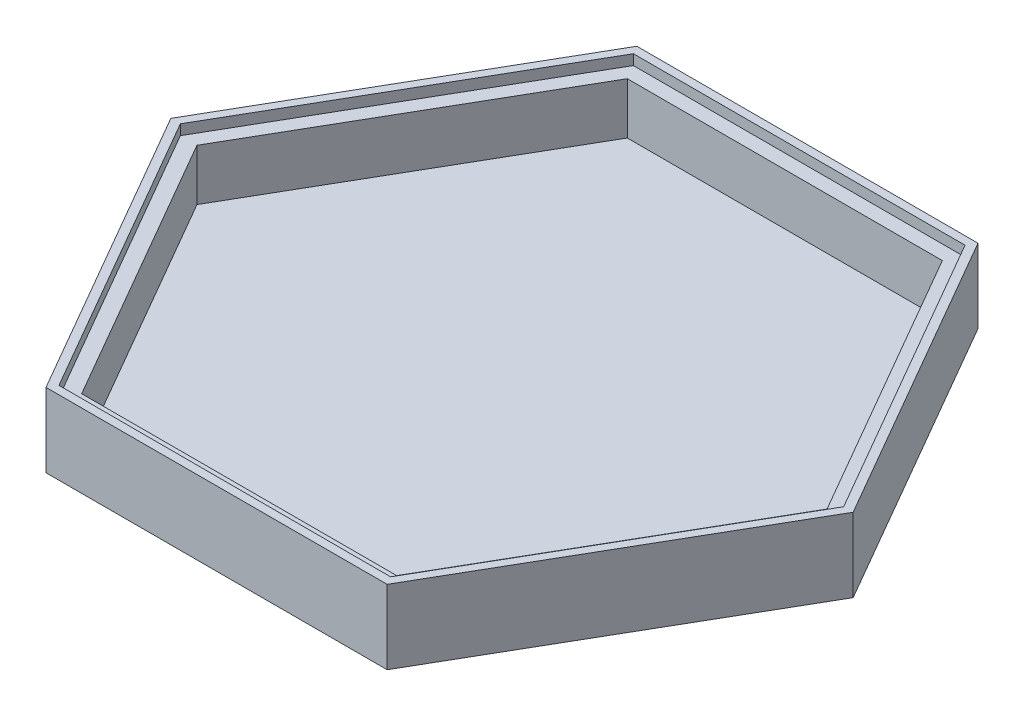
ISO-10303-21;
HEADER;
FILE_DESCRIPTION(('STEP AP214'),'2;1');
FILE_NAME('part.step','',(''),(''),'','','');
FILE_SCHEMA(('AUTOMOTIVE_DESIGN { 1 0 10303 214 1 1 1 1 }'));
ENDSEC;
DATA;
#1=APPLICATION_CONTEXT('core data for automotive mechanical design processes');
#2=APPLICATION_PROTOCOL_DEFINITION('international standard','automotive_design',2000,#1);
#3=PRODUCT_CONTEXT('',#1,'mechanical');
#4=PRODUCT('Part','Part','',(#3));
#5=PRODUCT_RELATED_PRODUCT_CATEGORY('part','',(#4));
#6=PRODUCT_DEFINITION_FORMATION('','',#4);
#7=PRODUCT_DEFINITION_CONTEXT('part definition',#1,'design');
#8=PRODUCT_DEFINITION('design','',#6,#7);
#9=PRODUCT_DEFINITION_SHAPE('','',#8);
#10=(LENGTH_UNIT() NAMED_UNIT(*) SI_UNIT(.MILLI.,.METRE.));
#11=(NAMED_UNIT(*) PLANE_ANGLE_UNIT() SI_UNIT($,.RADIAN.));
#12=(NAMED_UNIT(*) SI_UNIT($,.STERADIAN.) SOLID_ANGLE_UNIT());
#13=UNCERTAINTY_MEASURE_WITH_UNIT(LENGTH_MEASURE(1.E-05),#10,'distance_accuracy_value','');
#14=(GEOMETRIC_REPRESENTATION_CONTEXT(3) GLOBAL_UNCERTAINTY_ASSIGNED_CONTEXT((#13)) GLOBAL_UNIT_ASSIGNED_CONTEXT((#10,
#11,#12)) REPRESENTATION_CONTEXT('',''));
#15=CARTESIAN_POINT('',(0.,0.,0.));
#16=DIRECTION('',(0.,0.,1.));
#17=DIRECTION('',(1.,0.,0.));
#18=AXIS2_PLACEMENT_3D('',#15,#16,#17);
#19=CARTESIAN_POINT('',(0.,10.,-53.1000000000001));
#20=DIRECTION('',(0.,0.,1.));
#21=DIRECTION('',(1.,0.,0.));
#22=AXIS2_PLACEMENT_3D('',#19,#20,#21);
#23=PLANE('',#22);
#24=DIRECTION('',(-1.,0.,0.));
#25=VECTOR('',#24,1.);
#26=CARTESIAN_POINT('',(0.,0.,-53.1000000000001));
#27=LINE('',#26,#25);
#28=CARTESIAN_POINT('',(30.6572992939691,0.,-53.1000000000001));
#29=VERTEX_POINT('',#28);
#30=CARTESIAN_POINT('',(-30.6572992939692,0.,-53.1000000000001));
#31=VERTEX_POINT('',#30);
#32=EDGE_CURVE('E276',#29,#31,#27,.T.);
#33=ORIENTED_EDGE('',*,*,#32,.F.);
#34=DIRECTION('',(0.,-1.,0.));
#35=VECTOR('',#34,1.);
#36=CARTESIAN_POINT('',(30.6572992939691,10.,-53.1000000000001));
#37=LINE('',#36,#35);
#38=CARTESIAN_POINT('',(30.6572992939691,10.,-53.1000000000001));
#39=VERTEX_POINT('',#38);
#40=EDGE_CURVE('E388',#39,#29,#37,.T.);
#41=ORIENTED_EDGE('',*,*,#40,.F.);
#42=DIRECTION('',(-1.,0.,0.));
#43=VECTOR('',#42,1.);
#44=CARTESIAN_POINT('',(0.,10.,-53.1000000000001));
#45=LINE('',#44,#43);
#46=CARTESIAN_POINT('',(-30.6572992939692,10.,-53.1000000000001));
#47=VERTEX_POINT('',#46);
#48=EDGE_CURVE('E332',#39,#47,#45,.T.);
#49=ORIENTED_EDGE('',*,*,#48,.T.);
#50=DIRECTION('',(0.,-1.,0.));
#51=VECTOR('',#50,1.);
#52=CARTESIAN_POINT('',(-30.6572992939692,10.,-53.1000000000001));
#53=LINE('',#52,#51);
#54=EDGE_CURVE('E366',#47,#31,#53,.T.);
#55=ORIENTED_EDGE('',*,*,#54,.T.);
#56=EDGE_LOOP('',(#33,#41,#49,#55));
#57=FACE_BOUND('',#56,.T.);
#58=ADVANCED_FACE('F140',(#57),#23,.T.);
#59=CARTESIAN_POINT('',(45.9859489409537,10.,-26.55));
#60=DIRECTION('',(-0.866025403784439,0.,0.5));
#61=DIRECTION('',(0.5,0.,0.866025403784439));
#62=AXIS2_PLACEMENT_3D('',#59,#60,#61);
#63=PLANE('',#62);
#64=DIRECTION('',(-0.5,0.,-0.866025403784439));
#65=VECTOR('',#64,1.);
#66=CARTESIAN_POINT('',(45.9859489409537,0.,-26.55));
#67=LINE('',#66,#65);
#68=CARTESIAN_POINT('',(61.3145985879383,0.,0.));
#69=VERTEX_POINT('',#68);
#70=EDGE_CURVE('E157',#69,#29,#67,.T.);
#71=ORIENTED_EDGE('',*,*,#70,.F.);
#72=DIRECTION('',(0.,-1.,0.));
#73=VECTOR('',#72,1.);
#74=CARTESIAN_POINT('',(61.3145985879383,10.,0.));
#75=LINE('',#74,#73);
#76=CARTESIAN_POINT('',(61.3145985879383,10.,0.));
#77=VERTEX_POINT('',#76);
#78=EDGE_CURVE('E386',#77,#69,#75,.T.);
#79=ORIENTED_EDGE('',*,*,#78,.F.);
#80=DIRECTION('',(-0.5,0.,-0.866025403784439));
#81=VECTOR('',#80,1.);
#82=CARTESIAN_POINT('',(45.9859489409537,10.,-26.55));
#83=LINE('',#82,#81);
#84=EDGE_CURVE('E335',#77,#39,#83,.T.);
#85=ORIENTED_EDGE('',*,*,#84,.T.);
#86=ORIENTED_EDGE('',*,*,#40,.T.);
#87=EDGE_LOOP('',(#71,#79,#85,#86));
#88=FACE_BOUND('',#87,.T.);
#89=ADVANCED_FACE('F447',(#88),#63,.T.);
#90=CARTESIAN_POINT('',(45.9859489409537,10.,26.55));
#91=DIRECTION('',(-0.866025403784439,0.,-0.5));
#92=DIRECTION('',(-0.5,0.,0.866025403784439));
#93=AXIS2_PLACEMENT_3D('',#90,#91,#92);
#94=PLANE('',#93);
#95=DIRECTION('',(0.5,0.,-0.866025403784439));
#96=VECTOR('',#95,1.);
#97=CARTESIAN_POINT('',(45.9859489409537,0.,26.55));
#98=LINE('',#97,#96);
#99=CARTESIAN_POINT('',(30.6572992939691,0.,53.1000000000001));
#100=VERTEX_POINT('',#99);
#101=EDGE_CURVE('E162',#100,#69,#98,.T.);
#102=ORIENTED_EDGE('',*,*,#101,.F.);
#103=DIRECTION('',(0.,-1.,0.));
#104=VECTOR('',#103,1.);
#105=CARTESIAN_POINT('',(30.6572992939691,10.,53.1000000000001));
#106=LINE('',#105,#104);
#107=CARTESIAN_POINT('',(30.6572992939691,10.,53.1000000000001));
#108=VERTEX_POINT('',#107);
#109=EDGE_CURVE('E383',#108,#100,#106,.T.);
#110=ORIENTED_EDGE('',*,*,#109,.F.);
#111=DIRECTION('',(0.5,0.,-0.866025403784439));
#112=VECTOR('',#111,1.);
#113=CARTESIAN_POINT('',(45.9859489409537,10.,26.55));
#114=LINE('',#113,#112);
#115=EDGE_CURVE('E339',#108,#77,#114,.T.);
#116=ORIENTED_EDGE('',*,*,#115,.T.);
#117=ORIENTED_EDGE('',*,*,#78,.T.);
#118=EDGE_LOOP('',(#102,#110,#116,#117));
#119=FACE_BOUND('',#118,.T.);
#120=ADVANCED_FACE('F453',(#119),#94,.T.);
#121=CARTESIAN_POINT('',(0.,10.,53.1000000000001));
#122=DIRECTION('',(0.,0.,-1.));
#123=DIRECTION('',(-1.,0.,0.));
#124=AXIS2_PLACEMENT_3D('',#121,#122,#123);
#125=PLANE('',#124);
#126=DIRECTION('',(1.,0.,0.));
#127=VECTOR('',#126,1.);
#128=CARTESIAN_POINT('',(0.,0.,53.1000000000001));
#129=LINE('',#128,#127);
#130=CARTESIAN_POINT('',(-30.6572992939691,0.,53.1000000000001));
#131=VERTEX_POINT('',#130);
#132=EDGE_CURVE('E370',#131,#100,#129,.T.);
#133=ORIENTED_EDGE('',*,*,#132,.F.);
#134=DIRECTION('',(0.,-1.,0.));
#135=VECTOR('',#134,1.);
#136=CARTESIAN_POINT('',(-30.6572992939691,10.,53.1000000000001));
#137=LINE('',#136,#135);
#138=CARTESIAN_POINT('',(-30.6572992939691,10.,53.1000000000001));
#139=VERTEX_POINT('',#138);
#140=EDGE_CURVE('E380',#139,#131,#137,.T.);
#141=ORIENTED_EDGE('',*,*,#140,.F.);
#142=DIRECTION('',(1.,0.,0.));
#143=VECTOR('',#142,1.);
#144=CARTESIAN_POINT('',(0.,10.,53.1000000000001));
#145=LINE('',#144,#143);
#146=EDGE_CURVE('E342',#139,#108,#145,.T.);
#147=ORIENTED_EDGE('',*,*,#146,.T.);
#148=ORIENTED_EDGE('',*,*,#109,.T.);
#149=EDGE_LOOP('',(#133,#141,#147,#148));
#150=FACE_BOUND('',#149,.T.);
#151=ADVANCED_FACE('F482',(#150),#125,.T.);
#152=CARTESIAN_POINT('',(-45.9859489409537,10.,26.55));
#153=DIRECTION('',(0.866025403784439,0.,-0.5));
#154=DIRECTION('',(-0.5,0.,-0.866025403784439));
#155=AXIS2_PLACEMENT_3D('',#152,#153,#154);
#156=PLANE('',#155);
#157=DIRECTION('',(0.5,0.,0.866025403784439));
#158=VECTOR('',#157,1.);
#159=CARTESIAN_POINT('',(-45.9859489409537,0.,26.55));
#160=LINE('',#159,#158);
#161=CARTESIAN_POINT('',(-61.3145985879383,0.,0.));
#162=VERTEX_POINT('',#161);
#163=EDGE_CURVE('E372',#162,#131,#160,.T.);
#164=ORIENTED_EDGE('',*,*,#163,.F.);
#165=DIRECTION('',(0.,-1.,0.));
#166=VECTOR('',#165,1.);
#167=CARTESIAN_POINT('',(-61.3145985879383,10.,0.));
#168=LINE('',#167,#166);
#169=CARTESIAN_POINT('',(-61.3145985879383,10.,0.));
#170=VERTEX_POINT('',#169);
#171=EDGE_CURVE('E377',#170,#162,#168,.T.);
#172=ORIENTED_EDGE('',*,*,#171,.F.);
#173=DIRECTION('',(0.5,0.,0.866025403784439));
#174=VECTOR('',#173,1.);
#175=CARTESIAN_POINT('',(-45.9859489409537,10.,26.55));
#176=LINE('',#175,#174);
#177=EDGE_CURVE('E345',#170,#139,#176,.T.);
#178=ORIENTED_EDGE('',*,*,#177,.T.);
#179=ORIENTED_EDGE('',*,*,#140,.T.);
#180=EDGE_LOOP('',(#164,#172,#178,#179));
#181=FACE_BOUND('',#180,.T.);
#182=ADVANCED_FACE('F479',(#181),#156,.T.);
#183=CARTESIAN_POINT('',(-45.9859489409537,10.,-26.55));
#184=DIRECTION('',(0.866025403784439,0.,0.5));
#185=DIRECTION('',(0.5,0.,-0.866025403784439));
#186=AXIS2_PLACEMENT_3D('',#183,#184,#185);
#187=PLANE('',#186);
#188=DIRECTION('',(-0.5,0.,0.866025403784439));
#189=VECTOR('',#188,1.);
#190=CARTESIAN_POINT('',(-45.9859489409537,0.,-26.55));
#191=LINE('',#190,#189);
#192=EDGE_CURVE('E336',#31,#162,#191,.T.);
#193=ORIENTED_EDGE('',*,*,#192,.F.);
#194=ORIENTED_EDGE('',*,*,#54,.F.);
#195=DIRECTION('',(-0.5,0.,0.866025403784439));
#196=VECTOR('',#195,1.);
#197=CARTESIAN_POINT('',(-45.9859489409537,10.,-26.55));
#198=LINE('',#197,#196);
#199=EDGE_CURVE('E348',#47,#170,#198,.T.);
#200=ORIENTED_EDGE('',*,*,#199,.T.);
#201=ORIENTED_EDGE('',*,*,#171,.T.);
#202=EDGE_LOOP('',(#193,#194,#200,#201));
#203=FACE_BOUND('',#202,.T.);
#204=ADVANCED_FACE('F469',(#203),#187,.T.);
#205=CARTESIAN_POINT('',(0.,10.,0.));
#206=DIRECTION('',(0.,1.,0.));
#207=DIRECTION('',(0.,0.,1.));
#208=AXIS2_PLACEMENT_3D('',#205,#206,#207);
#209=PLANE('',#208);
#210=ORIENTED_EDGE('',*,*,#48,.F.);
#211=ORIENTED_EDGE('',*,*,#84,.F.);
#212=ORIENTED_EDGE('',*,*,#115,.F.);
#213=ORIENTED_EDGE('',*,*,#146,.F.);
#214=ORIENTED_EDGE('',*,*,#177,.F.);
#215=ORIENTED_EDGE('',*,*,#199,.F.);
#216=EDGE_LOOP('',(#210,#211,#212,#213,#214,#215));
#217=FACE_BOUND('',#216,.T.);
#218=DIRECTION('',(0.5,0.,-0.866025403784439));
#219=VECTOR('',#218,1.);
#220=CARTESIAN_POINT('',(48.4108200715501,10.,27.95));
#221=LINE('',#220,#219);
#222=CARTESIAN_POINT('',(32.2738800477001,10.,55.9000000000001));
#223=VERTEX_POINT('',#222);
#224=CARTESIAN_POINT('',(64.5477600954002,10.,0.));
#225=VERTEX_POINT('',#224);
#226=EDGE_CURVE('E351',#223,#225,#221,.T.);
#227=ORIENTED_EDGE('',*,*,#226,.T.);
#228=DIRECTION('',(-0.5,0.,-0.866025403784439));
#229=VECTOR('',#228,1.);
#230=CARTESIAN_POINT('',(48.4108200715501,10.,-27.95));
#231=LINE('',#230,#229);
#232=CARTESIAN_POINT('',(32.2738800477001,10.,-55.9000000000001));
#233=VERTEX_POINT('',#232);
#234=EDGE_CURVE('E272',#225,#233,#231,.T.);
#235=ORIENTED_EDGE('',*,*,#234,.T.);
#236=DIRECTION('',(-1.,0.,0.));
#237=VECTOR('',#236,1.);
#238=CARTESIAN_POINT('',(0.,10.,-55.9000000000001));
#239=LINE('',#238,#237);
#240=CARTESIAN_POINT('',(-32.2738800477001,10.,-55.9000000000001));
#241=VERTEX_POINT('',#240);
#242=EDGE_CURVE('E354',#233,#241,#239,.T.);
#243=ORIENTED_EDGE('',*,*,#242,.T.);
#244=DIRECTION('',(-0.5,0.,0.866025403784439));
#245=VECTOR('',#244,1.);
#246=CARTESIAN_POINT('',(-48.4108200715502,10.,-27.95));
#247=LINE('',#246,#245);
#248=CARTESIAN_POINT('',(-64.5477600954002,10.,0.));
#249=VERTEX_POINT('',#248);
#250=EDGE_CURVE('E357',#241,#249,#247,.T.);
#251=ORIENTED_EDGE('',*,*,#250,.T.);
#252=DIRECTION('',(0.5,0.,0.866025403784439));
#253=VECTOR('',#252,1.);
#254=CARTESIAN_POINT('',(-48.4108200715502,10.,27.95));
#255=LINE('',#254,#253);
#256=CARTESIAN_POINT('',(-32.2738800477001,10.,55.9));
#257=VERTEX_POINT('',#256);
#258=EDGE_CURVE('E360',#249,#257,#255,.T.);
#259=ORIENTED_EDGE('',*,*,#258,.T.);
#260=DIRECTION('',(1.,0.,0.));
#261=VECTOR('',#260,1.);
#262=CARTESIAN_POINT('',(0.,10.,55.9000000000001));
#263=LINE('',#262,#261);
#264=EDGE_CURVE('E363',#257,#223,#263,.T.);
#265=ORIENTED_EDGE('',*,*,#264,.T.);
#266=EDGE_LOOP('',(#227,#235,#243,#251,#259,#265));
#267=FACE_BOUND('',#266,.T.);
#268=ADVANCED_FACE('F463',(#217,#267),#209,.T.);
#269=CARTESIAN_POINT('',(0.,0.,0.));
#270=DIRECTION('',(0.,1.,0.));
#271=DIRECTION('',(0.,0.,1.));
#272=AXIS2_PLACEMENT_3D('',#269,#270,#271);
#273=PLANE('',#272);
#274=ORIENTED_EDGE('',*,*,#32,.T.);
#275=ORIENTED_EDGE('',*,*,#192,.T.);
#276=ORIENTED_EDGE('',*,*,#163,.T.);
#277=ORIENTED_EDGE('',*,*,#132,.T.);
#278=ORIENTED_EDGE('',*,*,#101,.T.);
#279=ORIENTED_EDGE('',*,*,#70,.T.);
#280=EDGE_LOOP('',(#274,#275,#276,#277,#278,#279));
#281=FACE_BOUND('',#280,.T.);
#282=ADVANCED_FACE('F461',(#281),#273,.T.);
#283=CARTESIAN_POINT('',(48.4108200715501,12.,-27.95));
#284=DIRECTION('',(-0.866025403784438,0.,0.5));
#285=DIRECTION('',(0.5,0.,0.866025403784439));
#286=AXIS2_PLACEMENT_3D('',#283,#284,#285);
#287=PLANE('',#286);
#288=DIRECTION('',(0.,-1.,0.));
#289=VECTOR('',#288,1.);
#290=CARTESIAN_POINT('',(32.2738800477001,12.,-55.9000000000001));
#291=LINE('',#290,#289);
#292=CARTESIAN_POINT('',(32.2738800477001,12.,-55.9000000000001));
#293=VERTEX_POINT('',#292);
#294=EDGE_CURVE('E321',#293,#233,#291,.T.);
#295=ORIENTED_EDGE('',*,*,#294,.T.);
#296=ORIENTED_EDGE('',*,*,#234,.F.);
#297=DIRECTION('',(0.,-1.,0.));
#298=VECTOR('',#297,1.);
#299=CARTESIAN_POINT('',(64.5477600954002,12.,0.));
#300=LINE('',#299,#298);
#301=CARTESIAN_POINT('',(64.5477600954002,12.,0.));
#302=VERTEX_POINT('',#301);
#303=EDGE_CURVE('E265',#302,#225,#300,.T.);
#304=ORIENTED_EDGE('',*,*,#303,.F.);
#305=DIRECTION('',(-0.5,0.,-0.866025403784439));
#306=VECTOR('',#305,1.);
#307=CARTESIAN_POINT('',(48.4108200715501,12.,-27.95));
#308=LINE('',#307,#306);
#309=EDGE_CURVE('E269',#302,#293,#308,.T.);
#310=ORIENTED_EDGE('',*,*,#309,.T.);
#311=EDGE_LOOP('',(#295,#296,#304,#310));
#312=FACE_BOUND('',#311,.T.);
#313=ADVANCED_FACE('F268',(#312),#287,.T.);
#314=CARTESIAN_POINT('',(48.4108200715501,12.,27.95));
#315=DIRECTION('',(-0.866025403784439,0.,-0.5));
#316=DIRECTION('',(-0.5,0.,0.866025403784439));
#317=AXIS2_PLACEMENT_3D('',#314,#315,#316);
#318=PLANE('',#317);
#319=ORIENTED_EDGE('',*,*,#303,.T.);
#320=ORIENTED_EDGE('',*,*,#226,.F.);
#321=DIRECTION('',(0.,-1.,0.));
#322=VECTOR('',#321,1.);
#323=CARTESIAN_POINT('',(32.2738800477001,12.,55.9000000000001));
#324=LINE('',#323,#322);
#325=CARTESIAN_POINT('',(32.2738800477001,12.,55.9000000000001));
#326=VERTEX_POINT('',#325);
#327=EDGE_CURVE('E277',#326,#223,#324,.T.);
#328=ORIENTED_EDGE('',*,*,#327,.F.);
#329=DIRECTION('',(0.5,0.,-0.866025403784439));
#330=VECTOR('',#329,1.);
#331=CARTESIAN_POINT('',(48.4108200715501,12.,27.95));
#332=LINE('',#331,#330);
#333=EDGE_CURVE('E284',#326,#302,#332,.T.);
#334=ORIENTED_EDGE('',*,*,#333,.T.);
#335=EDGE_LOOP('',(#319,#320,#328,#334));
#336=FACE_BOUND('',#335,.T.);
#337=ADVANCED_FACE('F290',(#336),#318,.T.);
#338=CARTESIAN_POINT('',(0.,12.,55.9000000000001));
#339=DIRECTION('',(0.,0.,-1.));
#340=DIRECTION('',(-1.,0.,0.));
#341=AXIS2_PLACEMENT_3D('',#338,#339,#340);
#342=PLANE('',#341);
#343=ORIENTED_EDGE('',*,*,#327,.T.);
#344=ORIENTED_EDGE('',*,*,#264,.F.);
#345=DIRECTION('',(0.,-1.,0.));
#346=VECTOR('',#345,1.);
#347=CARTESIAN_POINT('',(-32.2738800477001,12.,55.9));
#348=LINE('',#347,#346);
#349=CARTESIAN_POINT('',(-32.2738800477001,12.,55.9));
#350=VERTEX_POINT('',#349);
#351=EDGE_CURVE('E328',#350,#257,#348,.T.);
#352=ORIENTED_EDGE('',*,*,#351,.F.);
#353=DIRECTION('',(1.,0.,0.));
#354=VECTOR('',#353,1.);
#355=CARTESIAN_POINT('',(0.,12.,55.9000000000001));
#356=LINE('',#355,#354);
#357=EDGE_CURVE('E292',#350,#326,#356,.T.);
#358=ORIENTED_EDGE('',*,*,#357,.T.);
#359=EDGE_LOOP('',(#343,#344,#352,#358));
#360=FACE_BOUND('',#359,.T.);
#361=ADVANCED_FACE('F489',(#360),#342,.T.);
#362=CARTESIAN_POINT('',(-48.4108200715502,12.,27.95));
#363=DIRECTION('',(0.866025403784439,0.,-0.5));
#364=DIRECTION('',(-0.5,0.,-0.866025403784439));
#365=AXIS2_PLACEMENT_3D('',#362,#363,#364);
#366=PLANE('',#365);
#367=ORIENTED_EDGE('',*,*,#351,.T.);
#368=ORIENTED_EDGE('',*,*,#258,.F.);
#369=DIRECTION('',(0.,-1.,0.));
#370=VECTOR('',#369,1.);
#371=CARTESIAN_POINT('',(-64.5477600954002,12.,0.));
#372=LINE('',#371,#370);
#373=CARTESIAN_POINT('',(-64.5477600954002,12.,0.));
#374=VERTEX_POINT('',#373);
#375=EDGE_CURVE('E325',#374,#249,#372,.T.);
#376=ORIENTED_EDGE('',*,*,#375,.F.);
#377=DIRECTION('',(0.5,0.,0.866025403784439));
#378=VECTOR('',#377,1.);
#379=CARTESIAN_POINT('',(-48.4108200715502,12.,27.95));
#380=LINE('',#379,#378);
#381=EDGE_CURVE('E294',#374,#350,#380,.T.);
#382=ORIENTED_EDGE('',*,*,#381,.T.);
#383=EDGE_LOOP('',(#367,#368,#376,#382));
#384=FACE_BOUND('',#383,.T.);
#385=ADVANCED_FACE('F492',(#384),#366,.T.);
#386=CARTESIAN_POINT('',(-48.4108200715502,12.,-27.95));
#387=DIRECTION('',(0.866025403784438,0.,0.5));
#388=DIRECTION('',(0.5,0.,-0.866025403784439));
#389=AXIS2_PLACEMENT_3D('',#386,#387,#388);
#390=PLANE('',#389);
#391=ORIENTED_EDGE('',*,*,#375,.T.);
#392=ORIENTED_EDGE('',*,*,#250,.F.);
#393=DIRECTION('',(0.,-1.,0.));
#394=VECTOR('',#393,1.);
#395=CARTESIAN_POINT('',(-32.2738800477001,12.,-55.9000000000001));
#396=LINE('',#395,#394);
#397=CARTESIAN_POINT('',(-32.2738800477001,12.,-55.9000000000001));
#398=VERTEX_POINT('',#397);
#399=EDGE_CURVE('E323',#398,#241,#396,.T.);
#400=ORIENTED_EDGE('',*,*,#399,.F.);
#401=DIRECTION('',(-0.5,0.,0.866025403784439));
#402=VECTOR('',#401,1.);
#403=CARTESIAN_POINT('',(-48.4108200715502,12.,-27.95));
#404=LINE('',#403,#402);
#405=EDGE_CURVE('E299',#398,#374,#404,.T.);
#406=ORIENTED_EDGE('',*,*,#405,.T.);
#407=EDGE_LOOP('',(#391,#392,#400,#406));
#408=FACE_BOUND('',#407,.T.);
#409=ADVANCED_FACE('F495',(#408),#390,.T.);
#410=CARTESIAN_POINT('',(0.,12.,-55.9000000000001));
#411=DIRECTION('',(0.,0.,1.));
#412=DIRECTION('',(1.,0.,0.));
#413=AXIS2_PLACEMENT_3D('',#410,#411,#412);
#414=PLANE('',#413);
#415=ORIENTED_EDGE('',*,*,#399,.T.);
#416=ORIENTED_EDGE('',*,*,#242,.F.);
#417=ORIENTED_EDGE('',*,*,#294,.F.);
#418=DIRECTION('',(-1.,0.,0.));
#419=VECTOR('',#418,1.);
#420=CARTESIAN_POINT('',(0.,12.,-55.9000000000001));
#421=LINE('',#420,#419);
#422=EDGE_CURVE('E288',#293,#398,#421,.T.);
#423=ORIENTED_EDGE('',*,*,#422,.T.);
#424=EDGE_LOOP('',(#415,#416,#417,#423));
#425=FACE_BOUND('',#424,.T.);
#426=ADVANCED_FACE('F497',(#425),#414,.T.);
#427=CARTESIAN_POINT('',(0.,12.,0.));
#428=DIRECTION('',(0.,1.,0.));
#429=DIRECTION('',(0.,0.,1.));
#430=AXIS2_PLACEMENT_3D('',#427,#428,#429);
#431=PLANE('',#430);
#432=ORIENTED_EDGE('',*,*,#309,.F.);
#433=ORIENTED_EDGE('',*,*,#333,.F.);
#434=ORIENTED_EDGE('',*,*,#357,.F.);
#435=ORIENTED_EDGE('',*,*,#381,.F.);
#436=ORIENTED_EDGE('',*,*,#405,.F.);
#437=ORIENTED_EDGE('',*,*,#422,.F.);
#438=EDGE_LOOP('',(#432,#433,#434,#435,#436,#437));
#439=FACE_BOUND('',#438,.T.);
#440=DIRECTION('',(1.,0.,0.));
#441=VECTOR('',#440,1.);
#442=CARTESIAN_POINT('',(0.,12.,57.5));
#443=LINE('',#442,#441);
#444=CARTESIAN_POINT('',(-33.1976404784035,12.,57.5));
#445=VERTEX_POINT('',#444);
#446=CARTESIAN_POINT('',(33.1976404784035,12.,57.5000000000001));
#447=VERTEX_POINT('',#446);
#448=EDGE_CURVE('E303',#445,#447,#443,.T.);
#449=ORIENTED_EDGE('',*,*,#448,.T.);
#450=DIRECTION('',(0.5,0.,-0.866025403784439));
#451=VECTOR('',#450,1.);
#452=CARTESIAN_POINT('',(49.7964607176052,12.,28.75));
#453=LINE('',#452,#451);
#454=CARTESIAN_POINT('',(66.395280956807,12.,0.));
#455=VERTEX_POINT('',#454);
#456=EDGE_CURVE('E306',#447,#455,#453,.T.);
#457=ORIENTED_EDGE('',*,*,#456,.T.);
#458=DIRECTION('',(-0.5,0.,-0.866025403784439));
#459=VECTOR('',#458,1.);
#460=CARTESIAN_POINT('',(49.7964607176052,12.,-28.75));
#461=LINE('',#460,#459);
#462=CARTESIAN_POINT('',(33.1976404784035,12.,-57.5));
#463=VERTEX_POINT('',#462);
#464=EDGE_CURVE('E309',#455,#463,#461,.T.);
#465=ORIENTED_EDGE('',*,*,#464,.T.);
#466=DIRECTION('',(-1.,0.,0.));
#467=VECTOR('',#466,1.);
#468=CARTESIAN_POINT('',(0.,12.,-57.5));
#469=LINE('',#468,#467);
#470=CARTESIAN_POINT('',(-33.1976404784035,12.,-57.5));
#471=VERTEX_POINT('',#470);
#472=EDGE_CURVE('E312',#463,#471,#469,.T.);
#473=ORIENTED_EDGE('',*,*,#472,.T.);
#474=DIRECTION('',(-0.5,0.,0.866025403784439));
#475=VECTOR('',#474,1.);
#476=CARTESIAN_POINT('',(-49.7964607176052,12.,-28.75));
#477=LINE('',#476,#475);
#478=CARTESIAN_POINT('',(-66.395280956807,12.,0.));
#479=VERTEX_POINT('',#478);
#480=EDGE_CURVE('E315',#471,#479,#477,.T.);
#481=ORIENTED_EDGE('',*,*,#480,.T.);
#482=DIRECTION('',(0.5,0.,0.866025403784439));
#483=VECTOR('',#482,1.);
#484=CARTESIAN_POINT('',(-49.7964607176053,12.,28.75));
#485=LINE('',#484,#483);
#486=EDGE_CURVE('E318',#479,#445,#485,.T.);
#487=ORIENTED_EDGE('',*,*,#486,.T.);
#488=EDGE_LOOP('',(#449,#457,#465,#473,#481,#487));
#489=FACE_BOUND('',#488,.T.);
#490=ADVANCED_FACE('F281',(#439,#489),#431,.T.);
#491=CARTESIAN_POINT('',(0.,-2.4,0.));
#492=DIRECTION('',(0.,1.,0.));
#493=DIRECTION('',(0.,0.,1.));
#494=AXIS2_PLACEMENT_3D('',#491,#492,#493);
#495=PLANE('',#494);
#496=DIRECTION('',(1.,0.,0.));
#497=VECTOR('',#496,1.);
#498=CARTESIAN_POINT('',(0.,-2.4,57.5));
#499=LINE('',#498,#497);
#500=CARTESIAN_POINT('',(-33.1976404784035,-2.4,57.5));
#501=VERTEX_POINT('',#500);
#502=CARTESIAN_POINT('',(33.1976404784035,-2.4,57.5000000000001));
#503=VERTEX_POINT('',#502);
#504=EDGE_CURVE('E390',#501,#503,#499,.T.);
#505=ORIENTED_EDGE('',*,*,#504,.F.);
#506=DIRECTION('',(0.5,0.,0.866025403784439));
#507=VECTOR('',#506,1.);
#508=CARTESIAN_POINT('',(-49.7964607176053,-2.4,28.75));
#509=LINE('',#508,#507);
#510=CARTESIAN_POINT('',(-66.395280956807,-2.4,0.));
#511=VERTEX_POINT('',#510);
#512=EDGE_CURVE('E405',#511,#501,#509,.T.);
#513=ORIENTED_EDGE('',*,*,#512,.F.);
#514=DIRECTION('',(-0.5,0.,0.866025403784439));
#515=VECTOR('',#514,1.);
#516=CARTESIAN_POINT('',(-49.7964607176052,-2.4,-28.75));
#517=LINE('',#516,#515);
#518=CARTESIAN_POINT('',(-33.1976404784035,-2.4,-57.5));
#519=VERTEX_POINT('',#518);
#520=EDGE_CURVE('E402',#519,#511,#517,.T.);
#521=ORIENTED_EDGE('',*,*,#520,.F.);
#522=DIRECTION('',(-1.,0.,0.));
#523=VECTOR('',#522,1.);
#524=CARTESIAN_POINT('',(0.,-2.4,-57.5));
#525=LINE('',#524,#523);
#526=CARTESIAN_POINT('',(33.1976404784035,-2.4,-57.5));
#527=VERTEX_POINT('',#526);
#528=EDGE_CURVE('E399',#527,#519,#525,.T.);
#529=ORIENTED_EDGE('',*,*,#528,.F.);
#530=DIRECTION('',(-0.5,0.,-0.866025403784439));
#531=VECTOR('',#530,1.);
#532=CARTESIAN_POINT('',(49.7964607176052,-2.4,-28.75));
#533=LINE('',#532,#531);
#534=CARTESIAN_POINT('',(66.395280956807,-2.4,0.));
#535=VERTEX_POINT('',#534);
#536=EDGE_CURVE('E396',#535,#527,#533,.T.);
#537=ORIENTED_EDGE('',*,*,#536,.F.);
#538=DIRECTION('',(0.5,0.,-0.866025403784439));
#539=VECTOR('',#538,1.);
#540=CARTESIAN_POINT('',(49.7964607176052,-2.4,28.75));
#541=LINE('',#540,#539);
#542=EDGE_CURVE('E393',#503,#535,#541,.T.);
#543=ORIENTED_EDGE('',*,*,#542,.F.);
#544=EDGE_LOOP('',(#505,#513,#521,#529,#537,#543));
#545=FACE_BOUND('',#544,.T.);
#546=ADVANCED_FACE('F427',(#545),#495,.F.);
#547=CARTESIAN_POINT('',(0.,-2.4,-57.5));
#548=DIRECTION('',(0.,0.,-1.));
#549=DIRECTION('',(-1.,0.,0.));
#550=AXIS2_PLACEMENT_3D('',#547,#548,#549);
#551=PLANE('',#550);
#552=DIRECTION('',(0.,1.,0.));
#553=VECTOR('',#552,1.);
#554=CARTESIAN_POINT('',(-33.1976404784035,-2.4,-57.5));
#555=LINE('',#554,#553);
#556=EDGE_CURVE('E409',#519,#471,#555,.T.);
#557=ORIENTED_EDGE('',*,*,#556,.T.);
#558=ORIENTED_EDGE('',*,*,#472,.F.);
#559=DIRECTION('',(0.,1.,0.));
#560=VECTOR('',#559,1.);
#561=CARTESIAN_POINT('',(33.1976404784035,-2.4,-57.5));
#562=LINE('',#561,#560);
#563=EDGE_CURVE('E411',#527,#463,#562,.T.);
#564=ORIENTED_EDGE('',*,*,#563,.F.);
#565=ORIENTED_EDGE('',*,*,#528,.T.);
#566=EDGE_LOOP('',(#557,#558,#564,#565));
#567=FACE_BOUND('',#566,.T.);
#568=ADVANCED_FACE('F435',(#567),#551,.T.);
#569=CARTESIAN_POINT('',(-49.7964607176052,-2.4,-28.75));
#570=DIRECTION('',(-0.866025403784439,0.,-0.5));
#571=DIRECTION('',(-0.5,0.,0.866025403784439));
#572=AXIS2_PLACEMENT_3D('',#569,#570,#571);
#573=PLANE('',#572);
#574=DIRECTION('',(0.,1.,0.));
#575=VECTOR('',#574,1.);
#576=CARTESIAN_POINT('',(-66.395280956807,-2.4,0.));
#577=LINE('',#576,#575);
#578=EDGE_CURVE('E149',#511,#479,#577,.T.);
#579=ORIENTED_EDGE('',*,*,#578,.T.);
#580=ORIENTED_EDGE('',*,*,#480,.F.);
#581=ORIENTED_EDGE('',*,*,#556,.F.);
#582=ORIENTED_EDGE('',*,*,#520,.T.);
#583=EDGE_LOOP('',(#579,#580,#581,#582));
#584=FACE_BOUND('',#583,.T.);
#585=ADVANCED_FACE('F437',(#584),#573,.T.);
#586=CARTESIAN_POINT('',(-49.7964607176053,-2.4,28.75));
#587=DIRECTION('',(-0.866025403784439,0.,0.5));
#588=DIRECTION('',(0.5,0.,0.866025403784439));
#589=AXIS2_PLACEMENT_3D('',#586,#587,#588);
#590=PLANE('',#589);
#591=DIRECTION('',(0.,1.,0.));
#592=VECTOR('',#591,1.);
#593=CARTESIAN_POINT('',(-33.1976404784035,-2.4,57.5));
#594=LINE('',#593,#592);
#595=EDGE_CURVE('E12',#501,#445,#594,.T.);
#596=ORIENTED_EDGE('',*,*,#595,.T.);
#597=ORIENTED_EDGE('',*,*,#486,.F.);
#598=ORIENTED_EDGE('',*,*,#578,.F.);
#599=ORIENTED_EDGE('',*,*,#512,.T.);
#600=EDGE_LOOP('',(#596,#597,#598,#599));
#601=FACE_BOUND('',#600,.T.);
#602=ADVANCED_FACE('F424',(#601),#590,.T.);
#603=CARTESIAN_POINT('',(0.,-2.4,57.5));
#604=DIRECTION('',(0.,0.,1.));
#605=DIRECTION('',(1.,0.,0.));
#606=AXIS2_PLACEMENT_3D('',#603,#604,#605);
#607=PLANE('',#606);
#608=DIRECTION('',(0.,1.,0.));
#609=VECTOR('',#608,1.);
#610=CARTESIAN_POINT('',(33.1976404784035,-2.4,57.5000000000001));
#611=LINE('',#610,#609);
#612=EDGE_CURVE('E144',#503,#447,#611,.T.);
#613=ORIENTED_EDGE('',*,*,#612,.T.);
#614=ORIENTED_EDGE('',*,*,#448,.F.);
#615=ORIENTED_EDGE('',*,*,#595,.F.);
#616=ORIENTED_EDGE('',*,*,#504,.T.);
#617=EDGE_LOOP('',(#613,#614,#615,#616));
#618=FACE_BOUND('',#617,.T.);
#619=ADVANCED_FACE('F142',(#618),#607,.T.);
#620=CARTESIAN_POINT('',(49.7964607176052,-2.4,28.75));
#621=DIRECTION('',(0.866025403784439,0.,0.5));
#622=DIRECTION('',(0.5,0.,-0.866025403784439));
#623=AXIS2_PLACEMENT_3D('',#620,#621,#622);
#624=PLANE('',#623);
#625=DIRECTION('',(0.,1.,0.));
#626=VECTOR('',#625,1.);
#627=CARTESIAN_POINT('',(66.395280956807,-2.4,0.));
#628=LINE('',#627,#626);
#629=EDGE_CURVE('E412',#535,#455,#628,.T.);
#630=ORIENTED_EDGE('',*,*,#629,.T.);
#631=ORIENTED_EDGE('',*,*,#456,.F.);
#632=ORIENTED_EDGE('',*,*,#612,.F.);
#633=ORIENTED_EDGE('',*,*,#542,.T.);
#634=EDGE_LOOP('',(#630,#631,#632,#633));
#635=FACE_BOUND('',#634,.T.);
#636=ADVANCED_FACE('F419',(#635),#624,.T.);
#637=CARTESIAN_POINT('',(49.7964607176052,-2.4,-28.75));
#638=DIRECTION('',(0.866025403784439,0.,-0.5));
#639=DIRECTION('',(-0.5,0.,-0.866025403784439));
#640=AXIS2_PLACEMENT_3D('',#637,#638,#639);
#641=PLANE('',#640);
#642=ORIENTED_EDGE('',*,*,#563,.T.);
#643=ORIENTED_EDGE('',*,*,#464,.F.);
#644=ORIENTED_EDGE('',*,*,#629,.F.);
#645=ORIENTED_EDGE('',*,*,#536,.T.);
#646=EDGE_LOOP('',(#642,#643,#644,#645));
#647=FACE_BOUND('',#646,.T.);
#648=ADVANCED_FACE('F432',(#647),#641,.T.);
#649=CLOSED_SHELL('',(#58,#89,#120,#151,#182,#204,#268,#282,#313,#337,#361,#385,#409,#426,#490,
#546,#568,#585,#602,#619,#636,#648));
#650=MANIFOLD_SOLID_BREP('B2',#649);
#651=ADVANCED_BREP_SHAPE_REPRESENTATION('',(#18,#650),#14);
#652=SHAPE_DEFINITION_REPRESENTATION(#9,#651);
ENDSEC;
END-ISO-10303-21;
